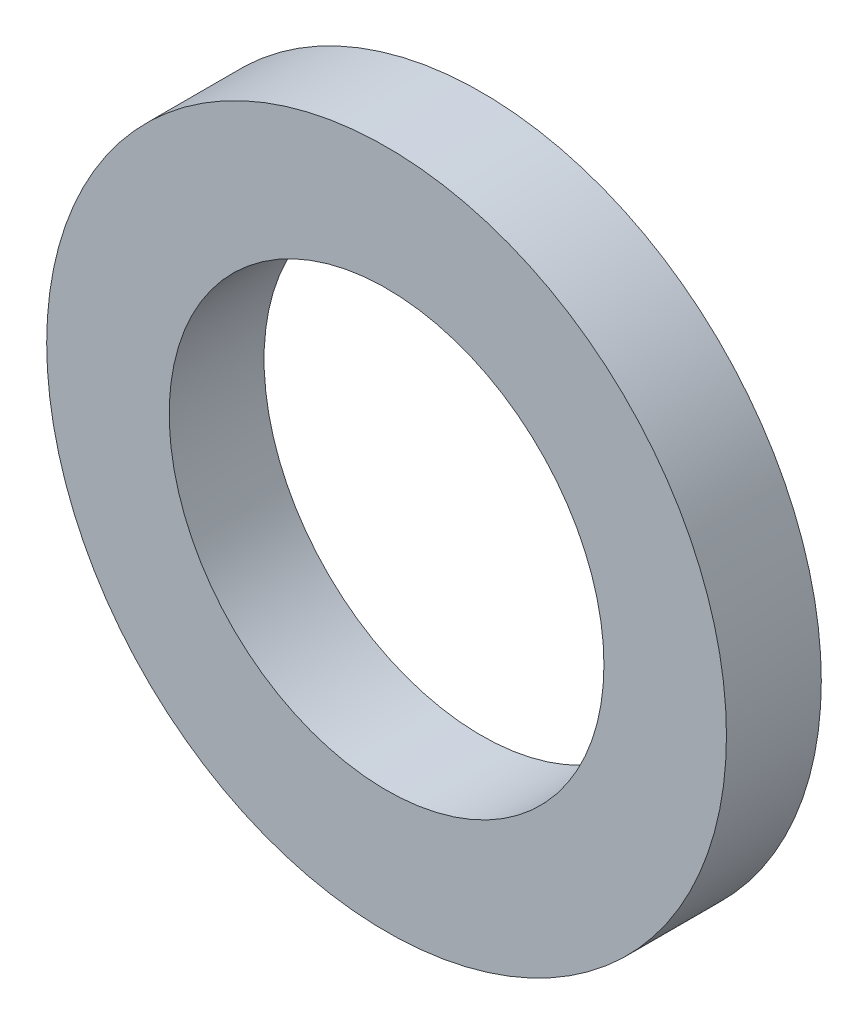
ISO-10303-21;
HEADER;
FILE_DESCRIPTION(('STEP AP214'),'2;1');
FILE_NAME('part.step','',(''),(''),'','','');
FILE_SCHEMA(('AUTOMOTIVE_DESIGN { 1 0 10303 214 1 1 1 1 }'));
ENDSEC;
DATA;
#1=APPLICATION_CONTEXT('core data for automotive mechanical design processes');
#2=APPLICATION_PROTOCOL_DEFINITION('international standard','automotive_design',2000,#1);
#3=PRODUCT_CONTEXT('',#1,'mechanical');
#4=PRODUCT('Part','Part','',(#3));
#5=PRODUCT_RELATED_PRODUCT_CATEGORY('part','',(#4));
#6=PRODUCT_DEFINITION_FORMATION('','',#4);
#7=PRODUCT_DEFINITION_CONTEXT('part definition',#1,'design');
#8=PRODUCT_DEFINITION('design','',#6,#7);
#9=PRODUCT_DEFINITION_SHAPE('','',#8);
#10=(LENGTH_UNIT() NAMED_UNIT(*) SI_UNIT(.MILLI.,.METRE.));
#11=(NAMED_UNIT(*) PLANE_ANGLE_UNIT() SI_UNIT($,.RADIAN.));
#12=(NAMED_UNIT(*) SI_UNIT($,.STERADIAN.) SOLID_ANGLE_UNIT());
#13=UNCERTAINTY_MEASURE_WITH_UNIT(LENGTH_MEASURE(1.E-05),#10,'distance_accuracy_value','');
#14=(GEOMETRIC_REPRESENTATION_CONTEXT(3) GLOBAL_UNCERTAINTY_ASSIGNED_CONTEXT((#13)) GLOBAL_UNIT_ASSIGNED_CONTEXT((#10,
#11,#12)) REPRESENTATION_CONTEXT('',''));
#15=CARTESIAN_POINT('',(0.,0.,0.));
#16=DIRECTION('',(0.,0.,1.));
#17=DIRECTION('',(1.,0.,0.));
#18=AXIS2_PLACEMENT_3D('',#15,#16,#17);
#19=CARTESIAN_POINT('',(0.,0.,12.));
#20=DIRECTION('',(0.,0.,1.));
#21=DIRECTION('',(1.,0.,0.));
#22=AXIS2_PLACEMENT_3D('',#19,#20,#21);
#23=PLANE('',#22);
#24=CARTESIAN_POINT('',(0.,0.,12.));
#25=DIRECTION('',(0.,0.,1.));
#26=DIRECTION('',(1.,0.,0.));
#27=AXIS2_PLACEMENT_3D('',#24,#25,#26);
#28=CIRCLE('',#27,43.);
#29=CARTESIAN_POINT('',(43.,0.,12.));
#30=VERTEX_POINT('',#29);
#31=EDGE_CURVE('E10',#30,#30,#28,.T.);
#32=ORIENTED_EDGE('',*,*,#31,.T.);
#33=EDGE_LOOP('',(#32));
#34=FACE_BOUND('',#33,.T.);
#35=CARTESIAN_POINT('',(0.,0.,12.));
#36=DIRECTION('',(0.,0.,1.));
#37=DIRECTION('',(1.,0.,0.));
#38=AXIS2_PLACEMENT_3D('',#35,#36,#37);
#39=CIRCLE('',#38,27.5);
#40=CARTESIAN_POINT('',(27.5,0.,12.));
#41=VERTEX_POINT('',#40);
#42=EDGE_CURVE('E50',#41,#41,#39,.T.);
#43=ORIENTED_EDGE('',*,*,#42,.F.);
#44=EDGE_LOOP('',(#43));
#45=FACE_BOUND('',#44,.T.);
#46=ADVANCED_FACE('F37',(#34,#45),#23,.T.);
#47=CARTESIAN_POINT('',(0.,0.,0.));
#48=DIRECTION('',(0.,0.,1.));
#49=DIRECTION('',(1.,0.,0.));
#50=AXIS2_PLACEMENT_3D('',#47,#48,#49);
#51=PLANE('',#50);
#52=CARTESIAN_POINT('',(0.,0.,0.));
#53=DIRECTION('',(0.,0.,1.));
#54=DIRECTION('',(1.,0.,0.));
#55=AXIS2_PLACEMENT_3D('',#52,#53,#54);
#56=CIRCLE('',#55,43.);
#57=CARTESIAN_POINT('',(43.,0.,0.));
#58=VERTEX_POINT('',#57);
#59=EDGE_CURVE('E41',#58,#58,#56,.T.);
#60=ORIENTED_EDGE('',*,*,#59,.F.);
#61=EDGE_LOOP('',(#60));
#62=FACE_BOUND('',#61,.T.);
#63=CARTESIAN_POINT('',(0.,0.,0.));
#64=DIRECTION('',(0.,0.,1.));
#65=DIRECTION('',(1.,0.,0.));
#66=AXIS2_PLACEMENT_3D('',#63,#64,#65);
#67=CIRCLE('',#66,27.5);
#68=CARTESIAN_POINT('',(27.5,0.,0.));
#69=VERTEX_POINT('',#68);
#70=EDGE_CURVE('E52',#69,#69,#67,.T.);
#71=ORIENTED_EDGE('',*,*,#70,.T.);
#72=EDGE_LOOP('',(#71));
#73=FACE_BOUND('',#72,.T.);
#74=ADVANCED_FACE('F64',(#62,#73),#51,.F.);
#75=CARTESIAN_POINT('',(0.,0.,12.));
#76=DIRECTION('',(0.,0.,-1.));
#77=DIRECTION('',(-1.,0.,0.));
#78=AXIS2_PLACEMENT_3D('',#75,#76,#77);
#79=CYLINDRICAL_SURFACE('',#78,43.);
#80=ORIENTED_EDGE('',*,*,#31,.F.);
#81=EDGE_LOOP('',(#80));
#82=FACE_BOUND('',#81,.T.);
#83=ORIENTED_EDGE('',*,*,#59,.T.);
#84=EDGE_LOOP('',(#83));
#85=FACE_BOUND('',#84,.T.);
#86=ADVANCED_FACE('F39',(#82,#85),#79,.T.);
#87=CARTESIAN_POINT('',(0.,0.,12.));
#88=DIRECTION('',(0.,0.,-1.));
#89=DIRECTION('',(-1.,0.,0.));
#90=AXIS2_PLACEMENT_3D('',#87,#88,#89);
#91=CYLINDRICAL_SURFACE('',#90,27.5);
#92=ORIENTED_EDGE('',*,*,#42,.T.);
#93=EDGE_LOOP('',(#92));
#94=FACE_BOUND('',#93,.T.);
#95=ORIENTED_EDGE('',*,*,#70,.F.);
#96=EDGE_LOOP('',(#95));
#97=FACE_BOUND('',#96,.T.);
#98=ADVANCED_FACE('F60',(#94,#97),#91,.F.);
#99=CLOSED_SHELL('',(#46,#74,#86,#98));
#100=MANIFOLD_SOLID_BREP('B2',#99);
#101=ADVANCED_BREP_SHAPE_REPRESENTATION('',(#18,#100),#14);
#102=SHAPE_DEFINITION_REPRESENTATION(#9,#101);
ENDSEC;
END-ISO-10303-21;
